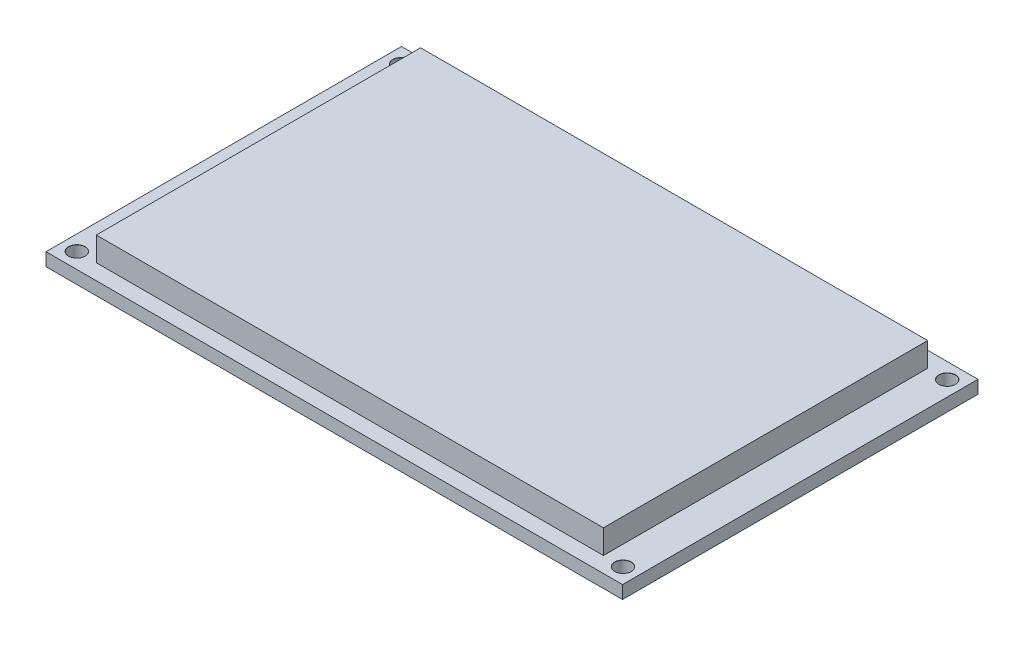
ISO-10303-21;
HEADER;
FILE_DESCRIPTION(('STEP AP214'),'2;1');
FILE_NAME('part.step','',(''),(''),'','','');
FILE_SCHEMA(('AUTOMOTIVE_DESIGN { 1 0 10303 214 1 1 1 1 }'));
ENDSEC;
DATA;
#1=APPLICATION_CONTEXT('core data for automotive mechanical design processes');
#2=APPLICATION_PROTOCOL_DEFINITION('international standard','automotive_design',2000,#1);
#3=PRODUCT_CONTEXT('',#1,'mechanical');
#4=PRODUCT('Part','Part','',(#3));
#5=PRODUCT_RELATED_PRODUCT_CATEGORY('part','',(#4));
#6=PRODUCT_DEFINITION_FORMATION('','',#4);
#7=PRODUCT_DEFINITION_CONTEXT('part definition',#1,'design');
#8=PRODUCT_DEFINITION('design','',#6,#7);
#9=PRODUCT_DEFINITION_SHAPE('','',#8);
#10=(LENGTH_UNIT() NAMED_UNIT(*) SI_UNIT(.MILLI.,.METRE.));
#11=(NAMED_UNIT(*) PLANE_ANGLE_UNIT() SI_UNIT($,.RADIAN.));
#12=(NAMED_UNIT(*) SI_UNIT($,.STERADIAN.) SOLID_ANGLE_UNIT());
#13=UNCERTAINTY_MEASURE_WITH_UNIT(LENGTH_MEASURE(1.E-05),#10,'distance_accuracy_value','');
#14=(GEOMETRIC_REPRESENTATION_CONTEXT(3) GLOBAL_UNCERTAINTY_ASSIGNED_CONTEXT((#13)) GLOBAL_UNIT_ASSIGNED_CONTEXT((#10,
#11,#12)) REPRESENTATION_CONTEXT('',''));
#15=CARTESIAN_POINT('',(0.,0.,0.));
#16=DIRECTION('',(0.,0.,1.));
#17=DIRECTION('',(1.,0.,0.));
#18=AXIS2_PLACEMENT_3D('',#15,#16,#17);
#19=CARTESIAN_POINT('',(0.,2.7,0.));
#20=DIRECTION('',(0.,-1.,0.));
#21=DIRECTION('',(0.,0.,-1.));
#22=AXIS2_PLACEMENT_3D('',#19,#20,#21);
#23=PLANE('',#22);
#24=CARTESIAN_POINT('',(-56.845,2.7,-33.735));
#25=DIRECTION('',(0.,1.,0.));
#26=DIRECTION('',(0.,0.,1.));
#27=AXIS2_PLACEMENT_3D('',#24,#25,#26);
#28=CIRCLE('',#27,1.725);
#29=CARTESIAN_POINT('',(-56.845,2.7,-32.01));
#30=VERTEX_POINT('',#29);
#31=EDGE_CURVE('E345',#30,#30,#28,.T.);
#32=ORIENTED_EDGE('',*,*,#31,.F.);
#33=EDGE_LOOP('',(#32));
#34=FACE_BOUND('',#33,.T.);
#35=CARTESIAN_POINT('',(56.845,2.7,-33.735));
#36=DIRECTION('',(0.,1.,0.));
#37=DIRECTION('',(0.,0.,1.));
#38=AXIS2_PLACEMENT_3D('',#35,#36,#37);
#39=CIRCLE('',#38,1.725);
#40=CARTESIAN_POINT('',(56.845,2.7,-32.01));
#41=VERTEX_POINT('',#40);
#42=EDGE_CURVE('E352',#41,#41,#39,.T.);
#43=ORIENTED_EDGE('',*,*,#42,.F.);
#44=EDGE_LOOP('',(#43));
#45=FACE_BOUND('',#44,.T.);
#46=CARTESIAN_POINT('',(56.845,2.7,33.735));
#47=DIRECTION('',(0.,1.,0.));
#48=DIRECTION('',(0.,0.,1.));
#49=AXIS2_PLACEMENT_3D('',#46,#47,#48);
#50=CIRCLE('',#49,1.725);
#51=CARTESIAN_POINT('',(56.845,2.7,35.46));
#52=VERTEX_POINT('',#51);
#53=EDGE_CURVE('E361',#52,#52,#50,.T.);
#54=ORIENTED_EDGE('',*,*,#53,.F.);
#55=EDGE_LOOP('',(#54));
#56=FACE_BOUND('',#55,.T.);
#57=CARTESIAN_POINT('',(-56.845,2.7,33.735));
#58=DIRECTION('',(0.,1.,0.));
#59=DIRECTION('',(0.,0.,1.));
#60=AXIS2_PLACEMENT_3D('',#57,#58,#59);
#61=CIRCLE('',#60,1.725);
#62=CARTESIAN_POINT('',(-56.845,2.7,35.46));
#63=VERTEX_POINT('',#62);
#64=EDGE_CURVE('E370',#63,#63,#61,.T.);
#65=ORIENTED_EDGE('',*,*,#64,.F.);
#66=EDGE_LOOP('',(#65));
#67=FACE_BOUND('',#66,.T.);
#68=DIRECTION('',(0.,0.,-1.));
#69=VECTOR('',#68,1.);
#70=CARTESIAN_POINT('',(60.,2.7,37.));
#71=LINE('',#70,#69);
#72=CARTESIAN_POINT('',(60.,2.7,37.));
#73=VERTEX_POINT('',#72);
#74=CARTESIAN_POINT('',(60.,2.7,-37.));
#75=VERTEX_POINT('',#74);
#76=EDGE_CURVE('E126',#73,#75,#71,.T.);
#77=ORIENTED_EDGE('',*,*,#76,.T.);
#78=DIRECTION('',(-1.,0.,0.));
#79=VECTOR('',#78,1.);
#80=CARTESIAN_POINT('',(-60.,2.7,-37.));
#81=LINE('',#80,#79);
#82=CARTESIAN_POINT('',(-60.,2.7,-37.));
#83=VERTEX_POINT('',#82);
#84=EDGE_CURVE('E129',#75,#83,#81,.T.);
#85=ORIENTED_EDGE('',*,*,#84,.T.);
#86=DIRECTION('',(0.,0.,1.));
#87=VECTOR('',#86,1.);
#88=CARTESIAN_POINT('',(-60.,2.7,37.));
#89=LINE('',#88,#87);
#90=CARTESIAN_POINT('',(-60.,2.7,37.));
#91=VERTEX_POINT('',#90);
#92=EDGE_CURVE('E132',#83,#91,#89,.T.);
#93=ORIENTED_EDGE('',*,*,#92,.T.);
#94=DIRECTION('',(1.,0.,0.));
#95=VECTOR('',#94,1.);
#96=CARTESIAN_POINT('',(-60.,2.7,37.));
#97=LINE('',#96,#95);
#98=EDGE_CURVE('E134',#91,#73,#97,.T.);
#99=ORIENTED_EDGE('',*,*,#98,.T.);
#100=EDGE_LOOP('',(#77,#85,#93,#99));
#101=FACE_BOUND('',#100,.T.);
#102=DIRECTION('',(0.,0.,-1.));
#103=VECTOR('',#102,1.);
#104=CARTESIAN_POINT('',(52.78,2.7,33.75));
#105=LINE('',#104,#103);
#106=CARTESIAN_POINT('',(52.78,2.7,33.75));
#107=VERTEX_POINT('',#106);
#108=CARTESIAN_POINT('',(52.78,2.7,-33.75));
#109=VERTEX_POINT('',#108);
#110=EDGE_CURVE('E47',#107,#109,#105,.T.);
#111=ORIENTED_EDGE('',*,*,#110,.F.);
#112=DIRECTION('',(1.,0.,0.));
#113=VECTOR('',#112,1.);
#114=CARTESIAN_POINT('',(-52.78,2.7,33.75));
#115=LINE('',#114,#113);
#116=CARTESIAN_POINT('',(-52.78,2.7,33.75));
#117=VERTEX_POINT('',#116);
#118=EDGE_CURVE('E51',#117,#107,#115,.T.);
#119=ORIENTED_EDGE('',*,*,#118,.F.);
#120=DIRECTION('',(0.,0.,1.));
#121=VECTOR('',#120,1.);
#122=CARTESIAN_POINT('',(-52.78,2.7,33.75));
#123=LINE('',#122,#121);
#124=CARTESIAN_POINT('',(-52.78,2.7,-33.75));
#125=VERTEX_POINT('',#124);
#126=EDGE_CURVE('E385',#125,#117,#123,.T.);
#127=ORIENTED_EDGE('',*,*,#126,.F.);
#128=DIRECTION('',(-1.,0.,0.));
#129=VECTOR('',#128,1.);
#130=CARTESIAN_POINT('',(-52.78,2.7,-33.75));
#131=LINE('',#130,#129);
#132=EDGE_CURVE('E383',#109,#125,#131,.T.);
#133=ORIENTED_EDGE('',*,*,#132,.F.);
#134=EDGE_LOOP('',(#111,#119,#127,#133));
#135=FACE_BOUND('',#134,.T.);
#136=ADVANCED_FACE('F32',(#34,#45,#56,#67,#101,#135),#23,.F.);
#137=CARTESIAN_POINT('',(60.,2.7,37.));
#138=DIRECTION('',(-1.,0.,0.));
#139=DIRECTION('',(0.,0.,1.));
#140=AXIS2_PLACEMENT_3D('',#137,#138,#139);
#141=PLANE('',#140);
#142=DIRECTION('',(0.,0.,-1.));
#143=VECTOR('',#142,1.);
#144=CARTESIAN_POINT('',(60.,0.,37.));
#145=LINE('',#144,#143);
#146=CARTESIAN_POINT('',(60.,0.,37.));
#147=VERTEX_POINT('',#146);
#148=CARTESIAN_POINT('',(60.,0.,-37.));
#149=VERTEX_POINT('',#148);
#150=EDGE_CURVE('E117',#147,#149,#145,.T.);
#151=ORIENTED_EDGE('',*,*,#150,.T.);
#152=DIRECTION('',(0.,-1.,0.));
#153=VECTOR('',#152,1.);
#154=CARTESIAN_POINT('',(60.,2.7,-37.));
#155=LINE('',#154,#153);
#156=EDGE_CURVE('E11',#75,#149,#155,.T.);
#157=ORIENTED_EDGE('',*,*,#156,.F.);
#158=ORIENTED_EDGE('',*,*,#76,.F.);
#159=DIRECTION('',(0.,-1.,0.));
#160=VECTOR('',#159,1.);
#161=CARTESIAN_POINT('',(60.,2.7,37.));
#162=LINE('',#161,#160);
#163=EDGE_CURVE('E135',#73,#147,#162,.T.);
#164=ORIENTED_EDGE('',*,*,#163,.T.);
#165=EDGE_LOOP('',(#151,#157,#158,#164));
#166=FACE_BOUND('',#165,.T.);
#167=ADVANCED_FACE('F34',(#166),#141,.F.);
#168=CARTESIAN_POINT('',(-60.,2.7,-37.));
#169=DIRECTION('',(0.,0.,1.));
#170=DIRECTION('',(1.,0.,0.));
#171=AXIS2_PLACEMENT_3D('',#168,#169,#170);
#172=PLANE('',#171);
#173=DIRECTION('',(-1.,0.,0.));
#174=VECTOR('',#173,1.);
#175=CARTESIAN_POINT('',(-60.,0.,-37.));
#176=LINE('',#175,#174);
#177=CARTESIAN_POINT('',(-60.,0.,-37.));
#178=VERTEX_POINT('',#177);
#179=EDGE_CURVE('E120',#149,#178,#176,.T.);
#180=ORIENTED_EDGE('',*,*,#179,.T.);
#181=DIRECTION('',(0.,-1.,0.));
#182=VECTOR('',#181,1.);
#183=CARTESIAN_POINT('',(-60.,2.7,-37.));
#184=LINE('',#183,#182);
#185=EDGE_CURVE('E40',#83,#178,#184,.T.);
#186=ORIENTED_EDGE('',*,*,#185,.F.);
#187=ORIENTED_EDGE('',*,*,#84,.F.);
#188=ORIENTED_EDGE('',*,*,#156,.T.);
#189=EDGE_LOOP('',(#180,#186,#187,#188));
#190=FACE_BOUND('',#189,.T.);
#191=ADVANCED_FACE('F165',(#190),#172,.F.);
#192=CARTESIAN_POINT('',(-60.,2.7,37.));
#193=DIRECTION('',(1.,0.,0.));
#194=DIRECTION('',(0.,0.,-1.));
#195=AXIS2_PLACEMENT_3D('',#192,#193,#194);
#196=PLANE('',#195);
#197=DIRECTION('',(0.,0.,1.));
#198=VECTOR('',#197,1.);
#199=CARTESIAN_POINT('',(-60.,0.,37.));
#200=LINE('',#199,#198);
#201=CARTESIAN_POINT('',(-60.,0.,37.));
#202=VERTEX_POINT('',#201);
#203=EDGE_CURVE('E138',#178,#202,#200,.T.);
#204=ORIENTED_EDGE('',*,*,#203,.T.);
#205=DIRECTION('',(0.,-1.,0.));
#206=VECTOR('',#205,1.);
#207=CARTESIAN_POINT('',(-60.,2.7,37.));
#208=LINE('',#207,#206);
#209=EDGE_CURVE('E143',#91,#202,#208,.T.);
#210=ORIENTED_EDGE('',*,*,#209,.F.);
#211=ORIENTED_EDGE('',*,*,#92,.F.);
#212=ORIENTED_EDGE('',*,*,#185,.T.);
#213=EDGE_LOOP('',(#204,#210,#211,#212));
#214=FACE_BOUND('',#213,.T.);
#215=ADVANCED_FACE('F150',(#214),#196,.F.);
#216=CARTESIAN_POINT('',(-60.,2.7,37.));
#217=DIRECTION('',(0.,0.,-1.));
#218=DIRECTION('',(-1.,0.,0.));
#219=AXIS2_PLACEMENT_3D('',#216,#217,#218);
#220=PLANE('',#219);
#221=DIRECTION('',(1.,0.,0.));
#222=VECTOR('',#221,1.);
#223=CARTESIAN_POINT('',(-60.,0.,37.));
#224=LINE('',#223,#222);
#225=EDGE_CURVE('E130',#202,#147,#224,.T.);
#226=ORIENTED_EDGE('',*,*,#225,.T.);
#227=ORIENTED_EDGE('',*,*,#163,.F.);
#228=ORIENTED_EDGE('',*,*,#98,.F.);
#229=ORIENTED_EDGE('',*,*,#209,.T.);
#230=EDGE_LOOP('',(#226,#227,#228,#229));
#231=FACE_BOUND('',#230,.T.);
#232=ADVANCED_FACE('F159',(#231),#220,.F.);
#233=CARTESIAN_POINT('',(0.,0.,0.));
#234=DIRECTION('',(0.,-1.,0.));
#235=DIRECTION('',(0.,0.,-1.));
#236=AXIS2_PLACEMENT_3D('',#233,#234,#235);
#237=PLANE('',#236);
#238=CARTESIAN_POINT('',(-56.845,0.,-33.735));
#239=DIRECTION('',(0.,1.,0.));
#240=DIRECTION('',(0.,0.,1.));
#241=AXIS2_PLACEMENT_3D('',#238,#239,#240);
#242=CIRCLE('',#241,1.7);
#243=CARTESIAN_POINT('',(-56.845,0.,-32.035));
#244=VERTEX_POINT('',#243);
#245=EDGE_CURVE('E347',#244,#244,#242,.T.);
#246=ORIENTED_EDGE('',*,*,#245,.T.);
#247=EDGE_LOOP('',(#246));
#248=FACE_BOUND('',#247,.T.);
#249=CARTESIAN_POINT('',(56.845,0.,-33.735));
#250=DIRECTION('',(0.,1.,0.));
#251=DIRECTION('',(0.,0.,1.));
#252=AXIS2_PLACEMENT_3D('',#249,#250,#251);
#253=CIRCLE('',#252,1.7);
#254=CARTESIAN_POINT('',(56.845,0.,-32.035));
#255=VERTEX_POINT('',#254);
#256=EDGE_CURVE('E358',#255,#255,#253,.T.);
#257=ORIENTED_EDGE('',*,*,#256,.T.);
#258=EDGE_LOOP('',(#257));
#259=FACE_BOUND('',#258,.T.);
#260=CARTESIAN_POINT('',(56.845,0.,33.735));
#261=DIRECTION('',(0.,1.,0.));
#262=DIRECTION('',(0.,0.,1.));
#263=AXIS2_PLACEMENT_3D('',#260,#261,#262);
#264=CIRCLE('',#263,1.7);
#265=CARTESIAN_POINT('',(56.845,0.,35.435));
#266=VERTEX_POINT('',#265);
#267=EDGE_CURVE('E367',#266,#266,#264,.T.);
#268=ORIENTED_EDGE('',*,*,#267,.T.);
#269=EDGE_LOOP('',(#268));
#270=FACE_BOUND('',#269,.T.);
#271=CARTESIAN_POINT('',(-56.845,0.,33.735));
#272=DIRECTION('',(0.,1.,0.));
#273=DIRECTION('',(0.,0.,1.));
#274=AXIS2_PLACEMENT_3D('',#271,#272,#273);
#275=CIRCLE('',#274,1.7);
#276=CARTESIAN_POINT('',(-56.845,0.,35.435));
#277=VERTEX_POINT('',#276);
#278=EDGE_CURVE('E376',#277,#277,#275,.T.);
#279=ORIENTED_EDGE('',*,*,#278,.T.);
#280=EDGE_LOOP('',(#279));
#281=FACE_BOUND('',#280,.T.);
#282=ORIENTED_EDGE('',*,*,#150,.F.);
#283=ORIENTED_EDGE('',*,*,#225,.F.);
#284=ORIENTED_EDGE('',*,*,#203,.F.);
#285=ORIENTED_EDGE('',*,*,#179,.F.);
#286=EDGE_LOOP('',(#282,#283,#284,#285));
#287=FACE_BOUND('',#286,.T.);
#288=ADVANCED_FACE('F156',(#248,#259,#270,#281,#287),#237,.T.);
#289=CARTESIAN_POINT('',(52.78,7.7,33.75));
#290=DIRECTION('',(-1.,0.,0.));
#291=DIRECTION('',(0.,0.,1.));
#292=AXIS2_PLACEMENT_3D('',#289,#290,#291);
#293=PLANE('',#292);
#294=ORIENTED_EDGE('',*,*,#110,.T.);
#295=DIRECTION('',(0.,-1.,0.));
#296=VECTOR('',#295,1.);
#297=CARTESIAN_POINT('',(52.78,7.7,-33.75));
#298=LINE('',#297,#296);
#299=CARTESIAN_POINT('',(52.78,7.7,-33.75));
#300=VERTEX_POINT('',#299);
#301=EDGE_CURVE('E100',#300,#109,#298,.T.);
#302=ORIENTED_EDGE('',*,*,#301,.F.);
#303=DIRECTION('',(0.,0.,-1.));
#304=VECTOR('',#303,1.);
#305=CARTESIAN_POINT('',(52.78,7.7,33.75));
#306=LINE('',#305,#304);
#307=CARTESIAN_POINT('',(52.78,7.7,33.75));
#308=VERTEX_POINT('',#307);
#309=EDGE_CURVE('E106',#308,#300,#306,.T.);
#310=ORIENTED_EDGE('',*,*,#309,.F.);
#311=DIRECTION('',(0.,-1.,0.));
#312=VECTOR('',#311,1.);
#313=CARTESIAN_POINT('',(52.78,7.7,33.75));
#314=LINE('',#313,#312);
#315=EDGE_CURVE('E381',#308,#107,#314,.T.);
#316=ORIENTED_EDGE('',*,*,#315,.T.);
#317=EDGE_LOOP('',(#294,#302,#310,#316));
#318=FACE_BOUND('',#317,.T.);
#319=ADVANCED_FACE('F116',(#318),#293,.F.);
#320=CARTESIAN_POINT('',(-52.78,7.7,-33.75));
#321=DIRECTION('',(0.,0.,1.));
#322=DIRECTION('',(1.,0.,0.));
#323=AXIS2_PLACEMENT_3D('',#320,#321,#322);
#324=PLANE('',#323);
#325=ORIENTED_EDGE('',*,*,#132,.T.);
#326=DIRECTION('',(0.,-1.,0.));
#327=VECTOR('',#326,1.);
#328=CARTESIAN_POINT('',(-52.78,7.7,-33.75));
#329=LINE('',#328,#327);
#330=CARTESIAN_POINT('',(-52.78,7.7,-33.75));
#331=VERTEX_POINT('',#330);
#332=EDGE_CURVE('E102',#331,#125,#329,.T.);
#333=ORIENTED_EDGE('',*,*,#332,.F.);
#334=DIRECTION('',(-1.,0.,0.));
#335=VECTOR('',#334,1.);
#336=CARTESIAN_POINT('',(-52.78,7.7,-33.75));
#337=LINE('',#336,#335);
#338=EDGE_CURVE('E95',#300,#331,#337,.T.);
#339=ORIENTED_EDGE('',*,*,#338,.F.);
#340=ORIENTED_EDGE('',*,*,#301,.T.);
#341=EDGE_LOOP('',(#325,#333,#339,#340));
#342=FACE_BOUND('',#341,.T.);
#343=ADVANCED_FACE('F98',(#342),#324,.F.);
#344=CARTESIAN_POINT('',(-52.78,7.7,33.75));
#345=DIRECTION('',(1.,0.,0.));
#346=DIRECTION('',(0.,0.,-1.));
#347=AXIS2_PLACEMENT_3D('',#344,#345,#346);
#348=PLANE('',#347);
#349=ORIENTED_EDGE('',*,*,#126,.T.);
#350=DIRECTION('',(0.,-1.,0.));
#351=VECTOR('',#350,1.);
#352=CARTESIAN_POINT('',(-52.78,7.7,33.75));
#353=LINE('',#352,#351);
#354=CARTESIAN_POINT('',(-52.78,7.7,33.75));
#355=VERTEX_POINT('',#354);
#356=EDGE_CURVE('E122',#355,#117,#353,.T.);
#357=ORIENTED_EDGE('',*,*,#356,.F.);
#358=DIRECTION('',(0.,0.,1.));
#359=VECTOR('',#358,1.);
#360=CARTESIAN_POINT('',(-52.78,7.7,33.75));
#361=LINE('',#360,#359);
#362=EDGE_CURVE('E105',#331,#355,#361,.T.);
#363=ORIENTED_EDGE('',*,*,#362,.F.);
#364=ORIENTED_EDGE('',*,*,#332,.T.);
#365=EDGE_LOOP('',(#349,#357,#363,#364));
#366=FACE_BOUND('',#365,.T.);
#367=ADVANCED_FACE('F206',(#366),#348,.F.);
#368=CARTESIAN_POINT('',(-52.78,7.7,33.75));
#369=DIRECTION('',(0.,0.,-1.));
#370=DIRECTION('',(-1.,0.,0.));
#371=AXIS2_PLACEMENT_3D('',#368,#369,#370);
#372=PLANE('',#371);
#373=ORIENTED_EDGE('',*,*,#118,.T.);
#374=ORIENTED_EDGE('',*,*,#315,.F.);
#375=DIRECTION('',(1.,0.,0.));
#376=VECTOR('',#375,1.);
#377=CARTESIAN_POINT('',(-52.78,7.7,33.75));
#378=LINE('',#377,#376);
#379=EDGE_CURVE('E111',#355,#308,#378,.T.);
#380=ORIENTED_EDGE('',*,*,#379,.F.);
#381=ORIENTED_EDGE('',*,*,#356,.T.);
#382=EDGE_LOOP('',(#373,#374,#380,#381));
#383=FACE_BOUND('',#382,.T.);
#384=ADVANCED_FACE('F212',(#383),#372,.F.);
#385=CARTESIAN_POINT('',(0.,7.7,0.));
#386=DIRECTION('',(0.,-1.,0.));
#387=DIRECTION('',(0.,0.,-1.));
#388=AXIS2_PLACEMENT_3D('',#385,#386,#387);
#389=PLANE('',#388);
#390=ORIENTED_EDGE('',*,*,#309,.T.);
#391=ORIENTED_EDGE('',*,*,#338,.T.);
#392=ORIENTED_EDGE('',*,*,#362,.T.);
#393=ORIENTED_EDGE('',*,*,#379,.T.);
#394=EDGE_LOOP('',(#390,#391,#392,#393));
#395=FACE_BOUND('',#394,.T.);
#396=ADVANCED_FACE('F109',(#395),#389,.F.);
#397=CARTESIAN_POINT('',(-56.845,2.7,33.735));
#398=DIRECTION('',(0.,1.,0.));
#399=DIRECTION('',(0.,0.,1.));
#400=AXIS2_PLACEMENT_3D('',#397,#398,#399);
#401=CYLINDRICAL_SURFACE('',#400,1.69999999999999);
#402=ORIENTED_EDGE('',*,*,#278,.F.);
#403=EDGE_LOOP('',(#402));
#404=FACE_BOUND('',#403,.T.);
#405=CARTESIAN_POINT('',(-56.845,2.67499999999997,33.735));
#406=DIRECTION('',(0.,1.,0.));
#407=DIRECTION('',(0.,0.,1.));
#408=AXIS2_PLACEMENT_3D('',#405,#406,#407);
#409=CIRCLE('',#408,1.69999999999999);
#410=CARTESIAN_POINT('',(-56.845,2.67499999999997,35.435));
#411=VERTEX_POINT('',#410);
#412=EDGE_CURVE('E373',#411,#411,#409,.T.);
#413=ORIENTED_EDGE('',*,*,#412,.T.);
#414=EDGE_LOOP('',(#413));
#415=FACE_BOUND('',#414,.T.);
#416=ADVANCED_FACE('F227',(#404,#415),#401,.F.);
#417=CARTESIAN_POINT('',(-56.845,2.7,33.735));
#418=DIRECTION('',(0.,1.,0.));
#419=DIRECTION('',(0.,0.,1.));
#420=AXIS2_PLACEMENT_3D('',#417,#418,#419);
#421=CONICAL_SURFACE('',#420,1.725,0.785398163397136);
#422=ORIENTED_EDGE('',*,*,#412,.F.);
#423=EDGE_LOOP('',(#422));
#424=FACE_BOUND('',#423,.T.);
#425=ORIENTED_EDGE('',*,*,#64,.T.);
#426=EDGE_LOOP('',(#425));
#427=FACE_BOUND('',#426,.T.);
#428=ADVANCED_FACE('F233',(#424,#427),#421,.F.);
#429=CARTESIAN_POINT('',(56.845,2.7,33.735));
#430=DIRECTION('',(0.,1.,0.));
#431=DIRECTION('',(0.,0.,1.));
#432=AXIS2_PLACEMENT_3D('',#429,#430,#431);
#433=CYLINDRICAL_SURFACE('',#432,1.69999999999999);
#434=ORIENTED_EDGE('',*,*,#267,.F.);
#435=EDGE_LOOP('',(#434));
#436=FACE_BOUND('',#435,.T.);
#437=CARTESIAN_POINT('',(56.845,2.67499999999997,33.735));
#438=DIRECTION('',(0.,1.,0.));
#439=DIRECTION('',(0.,0.,1.));
#440=AXIS2_PLACEMENT_3D('',#437,#438,#439);
#441=CIRCLE('',#440,1.69999999999999);
#442=CARTESIAN_POINT('',(56.845,2.67499999999997,35.435));
#443=VERTEX_POINT('',#442);
#444=EDGE_CURVE('E364',#443,#443,#441,.T.);
#445=ORIENTED_EDGE('',*,*,#444,.T.);
#446=EDGE_LOOP('',(#445));
#447=FACE_BOUND('',#446,.T.);
#448=ADVANCED_FACE('F241',(#436,#447),#433,.F.);
#449=CARTESIAN_POINT('',(56.845,2.7,33.735));
#450=DIRECTION('',(0.,1.,0.));
#451=DIRECTION('',(0.,0.,1.));
#452=AXIS2_PLACEMENT_3D('',#449,#450,#451);
#453=CONICAL_SURFACE('',#452,1.725,0.785398163397136);
#454=ORIENTED_EDGE('',*,*,#444,.F.);
#455=EDGE_LOOP('',(#454));
#456=FACE_BOUND('',#455,.T.);
#457=ORIENTED_EDGE('',*,*,#53,.T.);
#458=EDGE_LOOP('',(#457));
#459=FACE_BOUND('',#458,.T.);
#460=ADVANCED_FACE('F249',(#456,#459),#453,.F.);
#461=CARTESIAN_POINT('',(56.845,2.7,-33.735));
#462=DIRECTION('',(0.,1.,0.));
#463=DIRECTION('',(0.,0.,1.));
#464=AXIS2_PLACEMENT_3D('',#461,#462,#463);
#465=CYLINDRICAL_SURFACE('',#464,1.69999999999999);
#466=ORIENTED_EDGE('',*,*,#256,.F.);
#467=EDGE_LOOP('',(#466));
#468=FACE_BOUND('',#467,.T.);
#469=CARTESIAN_POINT('',(56.845,2.67499999999997,-33.735));
#470=DIRECTION('',(0.,1.,0.));
#471=DIRECTION('',(0.,0.,1.));
#472=AXIS2_PLACEMENT_3D('',#469,#470,#471);
#473=CIRCLE('',#472,1.69999999999999);
#474=CARTESIAN_POINT('',(56.845,2.67499999999997,-32.035));
#475=VERTEX_POINT('',#474);
#476=EDGE_CURVE('E355',#475,#475,#473,.T.);
#477=ORIENTED_EDGE('',*,*,#476,.T.);
#478=EDGE_LOOP('',(#477));
#479=FACE_BOUND('',#478,.T.);
#480=ADVANCED_FACE('F257',(#468,#479),#465,.F.);
#481=CARTESIAN_POINT('',(56.845,2.7,-33.735));
#482=DIRECTION('',(0.,1.,0.));
#483=DIRECTION('',(0.,0.,1.));
#484=AXIS2_PLACEMENT_3D('',#481,#482,#483);
#485=CONICAL_SURFACE('',#484,1.725,0.785398163397136);
#486=ORIENTED_EDGE('',*,*,#476,.F.);
#487=EDGE_LOOP('',(#486));
#488=FACE_BOUND('',#487,.T.);
#489=ORIENTED_EDGE('',*,*,#42,.T.);
#490=EDGE_LOOP('',(#489));
#491=FACE_BOUND('',#490,.T.);
#492=ADVANCED_FACE('F265',(#488,#491),#485,.F.);
#493=CARTESIAN_POINT('',(-56.845,2.7,-33.735));
#494=DIRECTION('',(0.,1.,0.));
#495=DIRECTION('',(0.,0.,1.));
#496=AXIS2_PLACEMENT_3D('',#493,#494,#495);
#497=CYLINDRICAL_SURFACE('',#496,1.69999999999999);
#498=ORIENTED_EDGE('',*,*,#245,.F.);
#499=EDGE_LOOP('',(#498));
#500=FACE_BOUND('',#499,.T.);
#501=CARTESIAN_POINT('',(-56.845,2.67499999999997,-33.735));
#502=DIRECTION('',(0.,1.,0.));
#503=DIRECTION('',(0.,0.,1.));
#504=AXIS2_PLACEMENT_3D('',#501,#502,#503);
#505=CIRCLE('',#504,1.69999999999999);
#506=CARTESIAN_POINT('',(-56.845,2.67499999999997,-32.035));
#507=VERTEX_POINT('',#506);
#508=EDGE_CURVE('E343',#507,#507,#505,.T.);
#509=ORIENTED_EDGE('',*,*,#508,.T.);
#510=EDGE_LOOP('',(#509));
#511=FACE_BOUND('',#510,.T.);
#512=ADVANCED_FACE('F273',(#500,#511),#497,.F.);
#513=CARTESIAN_POINT('',(-56.845,2.7,-33.735));
#514=DIRECTION('',(0.,1.,0.));
#515=DIRECTION('',(0.,0.,1.));
#516=AXIS2_PLACEMENT_3D('',#513,#514,#515);
#517=CONICAL_SURFACE('',#516,1.725,0.785398163397136);
#518=ORIENTED_EDGE('',*,*,#508,.F.);
#519=EDGE_LOOP('',(#518));
#520=FACE_BOUND('',#519,.T.);
#521=ORIENTED_EDGE('',*,*,#31,.T.);
#522=EDGE_LOOP('',(#521));
#523=FACE_BOUND('',#522,.T.);
#524=ADVANCED_FACE('F281',(#520,#523),#517,.F.);
#525=CLOSED_SHELL('',(#136,#167,#191,#215,#232,#288,#319,#343,#367,#384,#396,#416,#428,#448,
#460,#480,#492,#512,#524));
#526=MANIFOLD_SOLID_BREP('B2',#525);
#527=ADVANCED_BREP_SHAPE_REPRESENTATION('',(#18,#526),#14);
#528=SHAPE_DEFINITION_REPRESENTATION(#9,#527);
ENDSEC;
END-ISO-10303-21;
